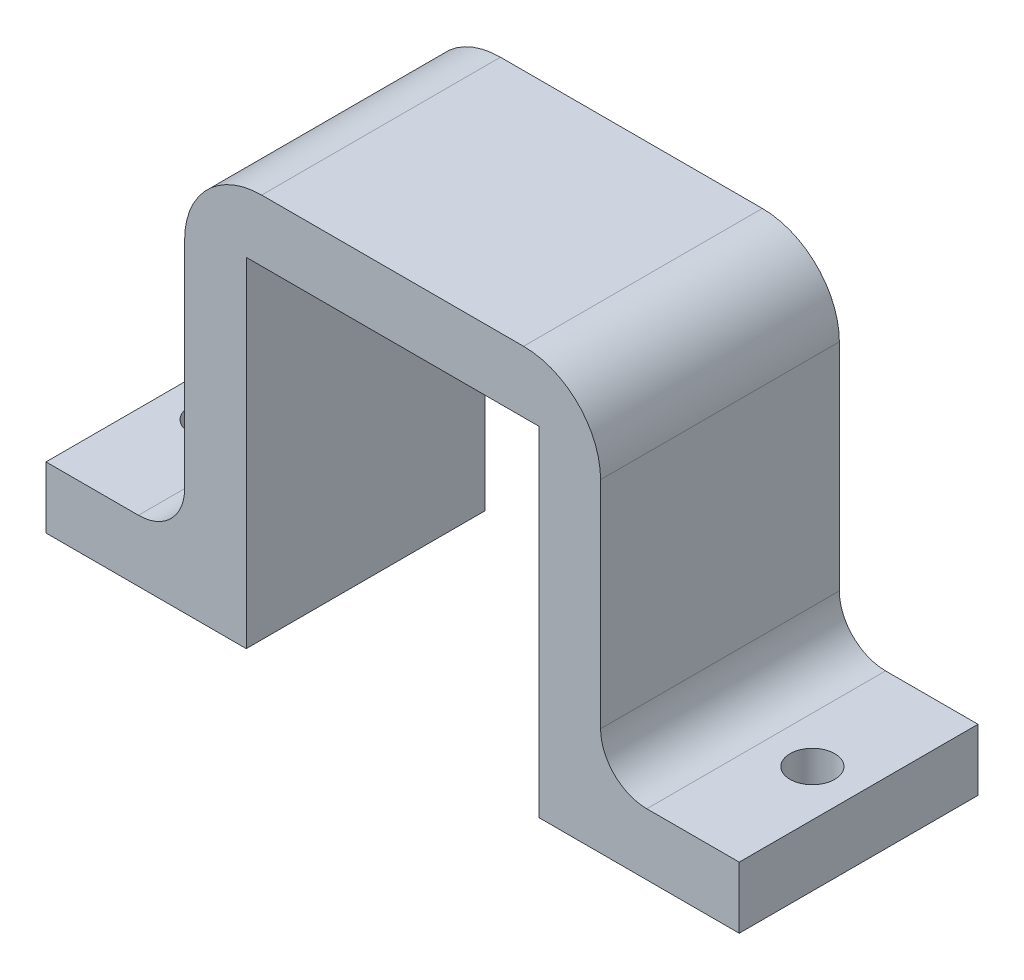
ISO-10303-21;
HEADER;
FILE_DESCRIPTION(('STEP AP214'),'2;1');
FILE_NAME('part.step','',(''),(''),'','','');
FILE_SCHEMA(('AUTOMOTIVE_DESIGN { 1 0 10303 214 1 1 1 1 }'));
ENDSEC;
DATA;
#1=APPLICATION_CONTEXT('core data for automotive mechanical design processes');
#2=APPLICATION_PROTOCOL_DEFINITION('international standard','automotive_design',2000,#1);
#3=PRODUCT_CONTEXT('',#1,'mechanical');
#4=PRODUCT('Part','Part','',(#3));
#5=PRODUCT_RELATED_PRODUCT_CATEGORY('part','',(#4));
#6=PRODUCT_DEFINITION_FORMATION('','',#4);
#7=PRODUCT_DEFINITION_CONTEXT('part definition',#1,'design');
#8=PRODUCT_DEFINITION('design','',#6,#7);
#9=PRODUCT_DEFINITION_SHAPE('','',#8);
#10=(LENGTH_UNIT() NAMED_UNIT(*) SI_UNIT(.MILLI.,.METRE.));
#11=(NAMED_UNIT(*) PLANE_ANGLE_UNIT() SI_UNIT($,.RADIAN.));
#12=(NAMED_UNIT(*) SI_UNIT($,.STERADIAN.) SOLID_ANGLE_UNIT());
#13=UNCERTAINTY_MEASURE_WITH_UNIT(LENGTH_MEASURE(1.E-05),#10,'distance_accuracy_value','');
#14=(GEOMETRIC_REPRESENTATION_CONTEXT(3) GLOBAL_UNCERTAINTY_ASSIGNED_CONTEXT((#13)) GLOBAL_UNIT_ASSIGNED_CONTEXT((#10,
#11,#12)) REPRESENTATION_CONTEXT('',''));
#15=CARTESIAN_POINT('',(0.,0.,0.));
#16=DIRECTION('',(0.,0.,1.));
#17=DIRECTION('',(1.,0.,0.));
#18=AXIS2_PLACEMENT_3D('',#15,#16,#17);
#19=CARTESIAN_POINT('',(0.,3.00000000000002,23.));
#20=DIRECTION('',(1.,0.,0.));
#21=DIRECTION('',(0.,0.,-1.));
#22=AXIS2_PLACEMENT_3D('',#19,#20,#21);
#23=PLANE('',#22);
#24=DIRECTION('',(0.,1.,0.));
#25=VECTOR('',#24,1.);
#26=CARTESIAN_POINT('',(0.,3.00000000000002,7.5));
#27=LINE('',#26,#25);
#28=CARTESIAN_POINT('',(0.,3.00000000000002,7.5));
#29=VERTEX_POINT('',#28);
#30=CARTESIAN_POINT('',(0.,17.,7.5));
#31=VERTEX_POINT('',#30);
#32=EDGE_CURVE('E301',#29,#31,#27,.T.);
#33=ORIENTED_EDGE('',*,*,#32,.F.);
#34=DIRECTION('',(0.,0.,-1.));
#35=VECTOR('',#34,1.);
#36=CARTESIAN_POINT('',(0.,3.00000000000002,23.));
#37=LINE('',#36,#35);
#38=CARTESIAN_POINT('',(0.,3.00000000000002,23.));
#39=VERTEX_POINT('',#38);
#40=EDGE_CURVE('E216',#39,#29,#37,.T.);
#41=ORIENTED_EDGE('',*,*,#40,.F.);
#42=DIRECTION('',(0.,-1.,0.));
#43=VECTOR('',#42,1.);
#44=CARTESIAN_POINT('',(0.,3.00000000000002,23.));
#45=LINE('',#44,#43);
#46=CARTESIAN_POINT('',(0.,17.,23.));
#47=VERTEX_POINT('',#46);
#48=EDGE_CURVE('E324',#47,#39,#45,.T.);
#49=ORIENTED_EDGE('',*,*,#48,.F.);
#50=DIRECTION('',(0.,0.,-1.));
#51=VECTOR('',#50,1.);
#52=CARTESIAN_POINT('',(0.,17.,23.));
#53=LINE('',#52,#51);
#54=EDGE_CURVE('E220',#47,#31,#53,.T.);
#55=ORIENTED_EDGE('',*,*,#54,.T.);
#56=EDGE_LOOP('',(#33,#41,#49,#55));
#57=FACE_BOUND('',#56,.T.);
#58=ADVANCED_FACE('F45',(#57),#23,.F.);
#59=CARTESIAN_POINT('',(-3.,3.,23.));
#60=DIRECTION('',(0.,0.,-1.));
#61=DIRECTION('',(-1.,0.,0.));
#62=AXIS2_PLACEMENT_3D('',#59,#60,#61);
#63=CYLINDRICAL_SURFACE('',#62,3.);
#64=CARTESIAN_POINT('',(-3.,3.,7.5));
#65=DIRECTION('',(0.,0.,-1.));
#66=DIRECTION('',(0.,1.,0.));
#67=AXIS2_PLACEMENT_3D('',#64,#65,#66);
#68=CIRCLE('',#67,3.);
#69=CARTESIAN_POINT('',(-3.00000000000002,0.,7.5));
#70=VERTEX_POINT('',#69);
#71=EDGE_CURVE('E298',#70,#29,#68,.F.);
#72=ORIENTED_EDGE('',*,*,#71,.F.);
#73=DIRECTION('',(0.,0.,-1.));
#74=VECTOR('',#73,1.);
#75=CARTESIAN_POINT('',(-3.00000000000002,0.,23.));
#76=LINE('',#75,#74);
#77=CARTESIAN_POINT('',(-3.00000000000002,0.,23.));
#78=VERTEX_POINT('',#77);
#79=EDGE_CURVE('E212',#78,#70,#76,.T.);
#80=ORIENTED_EDGE('',*,*,#79,.F.);
#81=CARTESIAN_POINT('',(-3.,3.,23.));
#82=DIRECTION('',(0.,0.,-1.));
#83=DIRECTION('',(-1.,0.,0.));
#84=AXIS2_PLACEMENT_3D('',#81,#82,#83);
#85=CIRCLE('',#84,3.);
#86=EDGE_CURVE('E327',#39,#78,#85,.T.);
#87=ORIENTED_EDGE('',*,*,#86,.F.);
#88=ORIENTED_EDGE('',*,*,#40,.T.);
#89=EDGE_LOOP('',(#72,#80,#87,#88));
#90=FACE_BOUND('',#89,.T.);
#91=ADVANCED_FACE('F375',(#90),#63,.F.);
#92=CARTESIAN_POINT('',(-9.,0.,23.));
#93=DIRECTION('',(0.,-1.,0.));
#94=DIRECTION('',(0.,0.,-1.));
#95=AXIS2_PLACEMENT_3D('',#92,#93,#94);
#96=PLANE('',#95);
#97=CARTESIAN_POINT('',(-6.00000000000001,0.,15.25));
#98=DIRECTION('',(0.,1.,0.));
#99=DIRECTION('',(0.,0.,1.));
#100=AXIS2_PLACEMENT_3D('',#97,#98,#99);
#101=CIRCLE('',#100,1.45);
#102=CARTESIAN_POINT('',(-6.00000000000001,0.,16.7));
#103=VERTEX_POINT('',#102);
#104=EDGE_CURVE('E248',#103,#103,#101,.T.);
#105=ORIENTED_EDGE('',*,*,#104,.F.);
#106=EDGE_LOOP('',(#105));
#107=FACE_BOUND('',#106,.T.);
#108=DIRECTION('',(1.,0.,0.));
#109=VECTOR('',#108,1.);
#110=CARTESIAN_POINT('',(-9.,0.,7.5));
#111=LINE('',#110,#109);
#112=CARTESIAN_POINT('',(-9.,0.,7.5));
#113=VERTEX_POINT('',#112);
#114=EDGE_CURVE('E295',#113,#70,#111,.T.);
#115=ORIENTED_EDGE('',*,*,#114,.F.);
#116=DIRECTION('',(0.,0.,-1.));
#117=VECTOR('',#116,1.);
#118=CARTESIAN_POINT('',(-9.,0.,23.));
#119=LINE('',#118,#117);
#120=CARTESIAN_POINT('',(-9.,0.,23.));
#121=VERTEX_POINT('',#120);
#122=EDGE_CURVE('E208',#121,#113,#119,.T.);
#123=ORIENTED_EDGE('',*,*,#122,.F.);
#124=DIRECTION('',(-1.,0.,0.));
#125=VECTOR('',#124,1.);
#126=CARTESIAN_POINT('',(-9.,0.,23.));
#127=LINE('',#126,#125);
#128=EDGE_CURVE('E330',#78,#121,#127,.T.);
#129=ORIENTED_EDGE('',*,*,#128,.F.);
#130=ORIENTED_EDGE('',*,*,#79,.T.);
#131=EDGE_LOOP('',(#115,#123,#129,#130));
#132=FACE_BOUND('',#131,.T.);
#133=ADVANCED_FACE('F370',(#107,#132),#96,.F.);
#134=CARTESIAN_POINT('',(-9.,-4.,23.));
#135=DIRECTION('',(1.,0.,0.));
#136=DIRECTION('',(0.,1.,0.));
#137=AXIS2_PLACEMENT_3D('',#134,#135,#136);
#138=PLANE('',#137);
#139=DIRECTION('',(0.,1.,0.));
#140=VECTOR('',#139,1.);
#141=CARTESIAN_POINT('',(-9.,-4.,7.5));
#142=LINE('',#141,#140);
#143=CARTESIAN_POINT('',(-9.,-4.,7.5));
#144=VERTEX_POINT('',#143);
#145=EDGE_CURVE('E292',#144,#113,#142,.T.);
#146=ORIENTED_EDGE('',*,*,#145,.F.);
#147=DIRECTION('',(0.,0.,-1.));
#148=VECTOR('',#147,1.);
#149=CARTESIAN_POINT('',(-9.,-4.,23.));
#150=LINE('',#149,#148);
#151=CARTESIAN_POINT('',(-9.,-4.,23.));
#152=VERTEX_POINT('',#151);
#153=EDGE_CURVE('E204',#152,#144,#150,.T.);
#154=ORIENTED_EDGE('',*,*,#153,.F.);
#155=DIRECTION('',(0.,-1.,0.));
#156=VECTOR('',#155,1.);
#157=CARTESIAN_POINT('',(-9.,-4.,23.));
#158=LINE('',#157,#156);
#159=EDGE_CURVE('E333',#121,#152,#158,.T.);
#160=ORIENTED_EDGE('',*,*,#159,.F.);
#161=ORIENTED_EDGE('',*,*,#122,.T.);
#162=EDGE_LOOP('',(#146,#154,#160,#161));
#163=FACE_BOUND('',#162,.T.);
#164=ADVANCED_FACE('F365',(#163),#138,.F.);
#165=CARTESIAN_POINT('',(4.,-4.,23.));
#166=DIRECTION('',(0.,1.,0.));
#167=DIRECTION('',(-1.,0.,0.));
#168=AXIS2_PLACEMENT_3D('',#165,#166,#167);
#169=PLANE('',#168);
#170=CARTESIAN_POINT('',(-6.00000000000001,-4.,15.25));
#171=DIRECTION('',(0.,1.,0.));
#172=DIRECTION('',(-1.,0.,0.));
#173=AXIS2_PLACEMENT_3D('',#170,#171,#172);
#174=CIRCLE('',#173,1.45);
#175=CARTESIAN_POINT('',(-7.45000000000001,-4.,15.25));
#176=VERTEX_POINT('',#175);
#177=EDGE_CURVE('E49',#176,#176,#174,.T.);
#178=ORIENTED_EDGE('',*,*,#177,.T.);
#179=EDGE_LOOP('',(#178));
#180=FACE_BOUND('',#179,.T.);
#181=DIRECTION('',(1.,0.,0.));
#182=VECTOR('',#181,1.);
#183=CARTESIAN_POINT('',(-23.,-4.,7.5));
#184=LINE('',#183,#182);
#185=CARTESIAN_POINT('',(4.,-4.,7.5));
#186=VERTEX_POINT('',#185);
#187=EDGE_CURVE('E288',#144,#186,#184,.T.);
#188=ORIENTED_EDGE('',*,*,#187,.T.);
#189=DIRECTION('',(0.,0.,-1.));
#190=VECTOR('',#189,1.);
#191=CARTESIAN_POINT('',(4.,-4.,23.));
#192=LINE('',#191,#190);
#193=CARTESIAN_POINT('',(4.,-4.,23.));
#194=VERTEX_POINT('',#193);
#195=EDGE_CURVE('E200',#194,#186,#192,.T.);
#196=ORIENTED_EDGE('',*,*,#195,.F.);
#197=DIRECTION('',(1.,0.,0.));
#198=VECTOR('',#197,1.);
#199=CARTESIAN_POINT('',(4.,-4.,23.));
#200=LINE('',#199,#198);
#201=EDGE_CURVE('E336',#152,#194,#200,.T.);
#202=ORIENTED_EDGE('',*,*,#201,.F.);
#203=ORIENTED_EDGE('',*,*,#153,.T.);
#204=EDGE_LOOP('',(#188,#196,#202,#203));
#205=FACE_BOUND('',#204,.T.);
#206=ADVANCED_FACE('F360',(#180,#205),#169,.F.);
#207=CARTESIAN_POINT('',(4.,18.,23.));
#208=DIRECTION('',(-1.,0.,0.));
#209=DIRECTION('',(0.,-1.,0.));
#210=AXIS2_PLACEMENT_3D('',#207,#208,#209);
#211=PLANE('',#210);
#212=DIRECTION('',(0.,-1.,0.));
#213=VECTOR('',#212,1.);
#214=CARTESIAN_POINT('',(4.,18.,7.5));
#215=LINE('',#214,#213);
#216=CARTESIAN_POINT('',(4.,18.,7.5));
#217=VERTEX_POINT('',#216);
#218=EDGE_CURVE('E11',#217,#186,#215,.T.);
#219=ORIENTED_EDGE('',*,*,#218,.F.);
#220=DIRECTION('',(0.,0.,-1.));
#221=VECTOR('',#220,1.);
#222=CARTESIAN_POINT('',(4.,18.,23.));
#223=LINE('',#222,#221);
#224=CARTESIAN_POINT('',(4.,18.,23.));
#225=VERTEX_POINT('',#224);
#226=EDGE_CURVE('E196',#225,#217,#223,.T.);
#227=ORIENTED_EDGE('',*,*,#226,.F.);
#228=DIRECTION('',(0.,1.,0.));
#229=VECTOR('',#228,1.);
#230=CARTESIAN_POINT('',(4.,18.,23.));
#231=LINE('',#230,#229);
#232=EDGE_CURVE('E339',#194,#225,#231,.T.);
#233=ORIENTED_EDGE('',*,*,#232,.F.);
#234=ORIENTED_EDGE('',*,*,#195,.T.);
#235=EDGE_LOOP('',(#219,#227,#233,#234));
#236=FACE_BOUND('',#235,.T.);
#237=ADVANCED_FACE('F356',(#236),#211,.F.);
#238=CARTESIAN_POINT('',(36.,0.,23.));
#239=DIRECTION('',(-1.,0.,0.));
#240=DIRECTION('',(0.,0.,1.));
#241=AXIS2_PLACEMENT_3D('',#238,#239,#240);
#242=PLANE('',#241);
#243=DIRECTION('',(0.,0.,-1.));
#244=VECTOR('',#243,1.);
#245=CARTESIAN_POINT('',(36.,-4.,23.));
#246=LINE('',#245,#244);
#247=CARTESIAN_POINT('',(36.,-4.,23.));
#248=VERTEX_POINT('',#247);
#249=CARTESIAN_POINT('',(36.,-4.00000000000001,7.5));
#250=VERTEX_POINT('',#249);
#251=EDGE_CURVE('E177',#248,#250,#246,.T.);
#252=ORIENTED_EDGE('',*,*,#251,.T.);
#253=DIRECTION('',(0.,1.,0.));
#254=VECTOR('',#253,1.);
#255=CARTESIAN_POINT('',(36.,-4.00000000000001,7.5));
#256=LINE('',#255,#254);
#257=CARTESIAN_POINT('',(36.,0.,7.5));
#258=VERTEX_POINT('',#257);
#259=EDGE_CURVE('E159',#250,#258,#256,.T.);
#260=ORIENTED_EDGE('',*,*,#259,.T.);
#261=DIRECTION('',(0.,0.,-1.));
#262=VECTOR('',#261,1.);
#263=CARTESIAN_POINT('',(36.,0.,23.));
#264=LINE('',#263,#262);
#265=CARTESIAN_POINT('',(36.,0.,23.));
#266=VERTEX_POINT('',#265);
#267=EDGE_CURVE('E55',#266,#258,#264,.T.);
#268=ORIENTED_EDGE('',*,*,#267,.F.);
#269=DIRECTION('',(0.,1.,0.));
#270=VECTOR('',#269,1.);
#271=CARTESIAN_POINT('',(36.,0.,23.));
#272=LINE('',#271,#270);
#273=EDGE_CURVE('E183',#248,#266,#272,.T.);
#274=ORIENTED_EDGE('',*,*,#273,.F.);
#275=EDGE_LOOP('',(#252,#260,#268,#274));
#276=FACE_BOUND('',#275,.T.);
#277=ADVANCED_FACE('F47',(#276),#242,.F.);
#278=CARTESIAN_POINT('',(30.,0.,23.));
#279=DIRECTION('',(0.,-1.,0.));
#280=DIRECTION('',(0.,0.,-1.));
#281=AXIS2_PLACEMENT_3D('',#278,#279,#280);
#282=PLANE('',#281);
#283=CARTESIAN_POINT('',(33.,0.,15.25));
#284=DIRECTION('',(0.,1.,0.));
#285=DIRECTION('',(0.,0.,-1.));
#286=AXIS2_PLACEMENT_3D('',#283,#284,#285);
#287=CIRCLE('',#286,1.45);
#288=CARTESIAN_POINT('',(33.,0.,13.8));
#289=VERTEX_POINT('',#288);
#290=EDGE_CURVE('E255',#289,#289,#287,.T.);
#291=ORIENTED_EDGE('',*,*,#290,.F.);
#292=EDGE_LOOP('',(#291));
#293=FACE_BOUND('',#292,.T.);
#294=ORIENTED_EDGE('',*,*,#267,.T.);
#295=DIRECTION('',(-1.,0.,0.));
#296=VECTOR('',#295,1.);
#297=CARTESIAN_POINT('',(30.,0.,7.5));
#298=LINE('',#297,#296);
#299=CARTESIAN_POINT('',(30.,0.,7.5));
#300=VERTEX_POINT('',#299);
#301=EDGE_CURVE('E166',#258,#300,#298,.T.);
#302=ORIENTED_EDGE('',*,*,#301,.T.);
#303=DIRECTION('',(0.,0.,-1.));
#304=VECTOR('',#303,1.);
#305=CARTESIAN_POINT('',(30.,0.,23.));
#306=LINE('',#305,#304);
#307=CARTESIAN_POINT('',(30.,0.,23.));
#308=VERTEX_POINT('',#307);
#309=EDGE_CURVE('E240',#308,#300,#306,.T.);
#310=ORIENTED_EDGE('',*,*,#309,.F.);
#311=DIRECTION('',(-1.,0.,0.));
#312=VECTOR('',#311,1.);
#313=CARTESIAN_POINT('',(30.,0.,23.));
#314=LINE('',#313,#312);
#315=EDGE_CURVE('E306',#266,#308,#314,.T.);
#316=ORIENTED_EDGE('',*,*,#315,.F.);
#317=EDGE_LOOP('',(#294,#302,#310,#316));
#318=FACE_BOUND('',#317,.T.);
#319=ADVANCED_FACE('F403',(#293,#318),#282,.F.);
#320=CARTESIAN_POINT('',(30.,3.,23.));
#321=DIRECTION('',(0.,0.,-1.));
#322=DIRECTION('',(-1.,0.,0.));
#323=AXIS2_PLACEMENT_3D('',#320,#321,#322);
#324=CYLINDRICAL_SURFACE('',#323,3.);
#325=ORIENTED_EDGE('',*,*,#309,.T.);
#326=CARTESIAN_POINT('',(30.,3.,7.5));
#327=DIRECTION('',(0.,0.,1.));
#328=DIRECTION('',(1.,0.,0.));
#329=AXIS2_PLACEMENT_3D('',#326,#327,#328);
#330=CIRCLE('',#329,3.);
#331=CARTESIAN_POINT('',(27.,3.,7.5));
#332=VERTEX_POINT('',#331);
#333=EDGE_CURVE('E282',#300,#332,#330,.F.);
#334=ORIENTED_EDGE('',*,*,#333,.T.);
#335=DIRECTION('',(0.,0.,-1.));
#336=VECTOR('',#335,1.);
#337=CARTESIAN_POINT('',(27.,3.,23.));
#338=LINE('',#337,#336);
#339=CARTESIAN_POINT('',(27.,3.,23.));
#340=VERTEX_POINT('',#339);
#341=EDGE_CURVE('E236',#340,#332,#338,.T.);
#342=ORIENTED_EDGE('',*,*,#341,.F.);
#343=CARTESIAN_POINT('',(30.,3.,23.));
#344=DIRECTION('',(0.,0.,-1.));
#345=DIRECTION('',(-1.,0.,0.));
#346=AXIS2_PLACEMENT_3D('',#343,#344,#345);
#347=CIRCLE('',#346,3.);
#348=EDGE_CURVE('E309',#308,#340,#347,.T.);
#349=ORIENTED_EDGE('',*,*,#348,.F.);
#350=EDGE_LOOP('',(#325,#334,#342,#349));
#351=FACE_BOUND('',#350,.T.);
#352=ADVANCED_FACE('F400',(#351),#324,.F.);
#353=CARTESIAN_POINT('',(27.,17.,23.));
#354=DIRECTION('',(-1.,0.,0.));
#355=DIRECTION('',(0.,-1.,0.));
#356=AXIS2_PLACEMENT_3D('',#353,#354,#355);
#357=PLANE('',#356);
#358=ORIENTED_EDGE('',*,*,#341,.T.);
#359=DIRECTION('',(0.,1.,0.));
#360=VECTOR('',#359,1.);
#361=CARTESIAN_POINT('',(27.,17.,7.5));
#362=LINE('',#361,#360);
#363=CARTESIAN_POINT('',(27.,17.,7.5));
#364=VERTEX_POINT('',#363);
#365=EDGE_CURVE('E278',#332,#364,#362,.T.);
#366=ORIENTED_EDGE('',*,*,#365,.T.);
#367=DIRECTION('',(0.,0.,-1.));
#368=VECTOR('',#367,1.);
#369=CARTESIAN_POINT('',(27.,17.,23.));
#370=LINE('',#369,#368);
#371=CARTESIAN_POINT('',(27.,17.,23.));
#372=VERTEX_POINT('',#371);
#373=EDGE_CURVE('E232',#372,#364,#370,.T.);
#374=ORIENTED_EDGE('',*,*,#373,.F.);
#375=DIRECTION('',(0.,1.,0.));
#376=VECTOR('',#375,1.);
#377=CARTESIAN_POINT('',(27.,17.,23.));
#378=LINE('',#377,#376);
#379=EDGE_CURVE('E312',#340,#372,#378,.T.);
#380=ORIENTED_EDGE('',*,*,#379,.F.);
#381=EDGE_LOOP('',(#358,#366,#374,#380));
#382=FACE_BOUND('',#381,.T.);
#383=ADVANCED_FACE('F396',(#382),#357,.F.);
#384=CARTESIAN_POINT('',(22.,17.,23.));
#385=DIRECTION('',(0.,0.,-1.));
#386=DIRECTION('',(-1.,0.,0.));
#387=AXIS2_PLACEMENT_3D('',#384,#385,#386);
#388=CYLINDRICAL_SURFACE('',#387,5.);
#389=ORIENTED_EDGE('',*,*,#373,.T.);
#390=CARTESIAN_POINT('',(22.,17.,7.5));
#391=DIRECTION('',(0.,0.,1.));
#392=DIRECTION('',(1.,0.,0.));
#393=AXIS2_PLACEMENT_3D('',#390,#391,#392);
#394=CIRCLE('',#393,5.);
#395=CARTESIAN_POINT('',(22.,22.,7.5));
#396=VERTEX_POINT('',#395);
#397=EDGE_CURVE('E274',#364,#396,#394,.T.);
#398=ORIENTED_EDGE('',*,*,#397,.T.);
#399=DIRECTION('',(0.,0.,-1.));
#400=VECTOR('',#399,1.);
#401=CARTESIAN_POINT('',(22.,22.,23.));
#402=LINE('',#401,#400);
#403=CARTESIAN_POINT('',(22.,22.,23.));
#404=VERTEX_POINT('',#403);
#405=EDGE_CURVE('E228',#404,#396,#402,.T.);
#406=ORIENTED_EDGE('',*,*,#405,.F.);
#407=CARTESIAN_POINT('',(22.,17.,23.));
#408=DIRECTION('',(0.,0.,1.));
#409=DIRECTION('',(-1.,0.,0.));
#410=AXIS2_PLACEMENT_3D('',#407,#408,#409);
#411=CIRCLE('',#410,5.);
#412=EDGE_CURVE('E315',#372,#404,#411,.T.);
#413=ORIENTED_EDGE('',*,*,#412,.F.);
#414=EDGE_LOOP('',(#389,#398,#406,#413));
#415=FACE_BOUND('',#414,.T.);
#416=ADVANCED_FACE('F394',(#415),#388,.T.);
#417=CARTESIAN_POINT('',(5.00000000000004,22.,23.));
#418=DIRECTION('',(0.,-1.,0.));
#419=DIRECTION('',(0.,0.,-1.));
#420=AXIS2_PLACEMENT_3D('',#417,#418,#419);
#421=PLANE('',#420);
#422=ORIENTED_EDGE('',*,*,#405,.T.);
#423=DIRECTION('',(1.,0.,0.));
#424=VECTOR('',#423,1.);
#425=CARTESIAN_POINT('',(-9.,22.,7.5));
#426=LINE('',#425,#424);
#427=CARTESIAN_POINT('',(5.,22.,7.5));
#428=VERTEX_POINT('',#427);
#429=EDGE_CURVE('E181',#428,#396,#426,.T.);
#430=ORIENTED_EDGE('',*,*,#429,.F.);
#431=DIRECTION('',(0.,0.,-1.));
#432=VECTOR('',#431,1.);
#433=CARTESIAN_POINT('',(5.00000000000004,22.,23.));
#434=LINE('',#433,#432);
#435=CARTESIAN_POINT('',(5.00000000000004,22.,23.));
#436=VERTEX_POINT('',#435);
#437=EDGE_CURVE('E224',#436,#428,#434,.T.);
#438=ORIENTED_EDGE('',*,*,#437,.F.);
#439=DIRECTION('',(-1.,0.,0.));
#440=VECTOR('',#439,1.);
#441=CARTESIAN_POINT('',(5.00000000000004,22.,23.));
#442=LINE('',#441,#440);
#443=EDGE_CURVE('E318',#404,#436,#442,.T.);
#444=ORIENTED_EDGE('',*,*,#443,.F.);
#445=EDGE_LOOP('',(#422,#430,#438,#444));
#446=FACE_BOUND('',#445,.T.);
#447=ADVANCED_FACE('F385',(#446),#421,.F.);
#448=CARTESIAN_POINT('',(5.,17.,23.));
#449=DIRECTION('',(0.,0.,-1.));
#450=DIRECTION('',(-1.,0.,0.));
#451=AXIS2_PLACEMENT_3D('',#448,#449,#450);
#452=CYLINDRICAL_SURFACE('',#451,5.);
#453=ORIENTED_EDGE('',*,*,#437,.T.);
#454=CARTESIAN_POINT('',(5.,17.,7.5));
#455=DIRECTION('',(0.,0.,1.));
#456=DIRECTION('',(1.,0.,0.));
#457=AXIS2_PLACEMENT_3D('',#454,#455,#456);
#458=CIRCLE('',#457,5.);
#459=EDGE_CURVE('E172',#428,#31,#458,.T.);
#460=ORIENTED_EDGE('',*,*,#459,.T.);
#461=ORIENTED_EDGE('',*,*,#54,.F.);
#462=CARTESIAN_POINT('',(5.,17.,23.));
#463=DIRECTION('',(0.,0.,1.));
#464=DIRECTION('',(1.,0.,0.));
#465=AXIS2_PLACEMENT_3D('',#462,#463,#464);
#466=CIRCLE('',#465,5.);
#467=EDGE_CURVE('E321',#436,#47,#466,.T.);
#468=ORIENTED_EDGE('',*,*,#467,.F.);
#469=EDGE_LOOP('',(#453,#460,#461,#468));
#470=FACE_BOUND('',#469,.T.);
#471=ADVANCED_FACE('F389',(#470),#452,.T.);
#472=CARTESIAN_POINT('',(23.,18.,23.));
#473=DIRECTION('',(0.,1.,0.));
#474=DIRECTION('',(-1.,0.,0.));
#475=AXIS2_PLACEMENT_3D('',#472,#473,#474);
#476=PLANE('',#475);
#477=ORIENTED_EDGE('',*,*,#226,.T.);
#478=DIRECTION('',(1.,0.,0.));
#479=VECTOR('',#478,1.);
#480=CARTESIAN_POINT('',(23.,18.,7.5));
#481=LINE('',#480,#479);
#482=CARTESIAN_POINT('',(23.,18.,7.5));
#483=VERTEX_POINT('',#482);
#484=EDGE_CURVE('E267',#217,#483,#481,.T.);
#485=ORIENTED_EDGE('',*,*,#484,.T.);
#486=DIRECTION('',(0.,0.,-1.));
#487=VECTOR('',#486,1.);
#488=CARTESIAN_POINT('',(23.,18.,23.));
#489=LINE('',#488,#487);
#490=CARTESIAN_POINT('',(23.,18.,23.));
#491=VERTEX_POINT('',#490);
#492=EDGE_CURVE('E188',#491,#483,#489,.T.);
#493=ORIENTED_EDGE('',*,*,#492,.F.);
#494=DIRECTION('',(1.,0.,0.));
#495=VECTOR('',#494,1.);
#496=CARTESIAN_POINT('',(23.,18.,23.));
#497=LINE('',#496,#495);
#498=EDGE_CURVE('E342',#225,#491,#497,.T.);
#499=ORIENTED_EDGE('',*,*,#498,.F.);
#500=EDGE_LOOP('',(#477,#485,#493,#499));
#501=FACE_BOUND('',#500,.T.);
#502=ADVANCED_FACE('F351',(#501),#476,.F.);
#503=CARTESIAN_POINT('',(23.,-4.,23.));
#504=DIRECTION('',(1.,0.,0.));
#505=DIRECTION('',(0.,0.,-1.));
#506=AXIS2_PLACEMENT_3D('',#503,#504,#505);
#507=PLANE('',#506);
#508=ORIENTED_EDGE('',*,*,#492,.T.);
#509=DIRECTION('',(0.,-1.,0.));
#510=VECTOR('',#509,1.);
#511=CARTESIAN_POINT('',(23.,-4.,7.5));
#512=LINE('',#511,#510);
#513=CARTESIAN_POINT('',(23.,-4.00000000000001,7.5));
#514=VERTEX_POINT('',#513);
#515=EDGE_CURVE('E271',#483,#514,#512,.T.);
#516=ORIENTED_EDGE('',*,*,#515,.T.);
#517=DIRECTION('',(0.,0.,-1.));
#518=VECTOR('',#517,1.);
#519=CARTESIAN_POINT('',(23.,-4.,23.));
#520=LINE('',#519,#518);
#521=CARTESIAN_POINT('',(23.,-4.,23.));
#522=VERTEX_POINT('',#521);
#523=EDGE_CURVE('E179',#522,#514,#520,.T.);
#524=ORIENTED_EDGE('',*,*,#523,.F.);
#525=DIRECTION('',(0.,-1.,0.));
#526=VECTOR('',#525,1.);
#527=CARTESIAN_POINT('',(23.,-4.,23.));
#528=LINE('',#527,#526);
#529=EDGE_CURVE('E68',#491,#522,#528,.T.);
#530=ORIENTED_EDGE('',*,*,#529,.F.);
#531=EDGE_LOOP('',(#508,#516,#524,#530));
#532=FACE_BOUND('',#531,.T.);
#533=ADVANCED_FACE('F354',(#532),#507,.F.);
#534=CARTESIAN_POINT('',(36.,-4.,23.));
#535=DIRECTION('',(0.,1.,0.));
#536=DIRECTION('',(-1.,0.,0.));
#537=AXIS2_PLACEMENT_3D('',#534,#535,#536);
#538=PLANE('',#537);
#539=CARTESIAN_POINT('',(33.,-4.,15.25));
#540=DIRECTION('',(0.,1.,0.));
#541=DIRECTION('',(-1.,0.,0.));
#542=AXIS2_PLACEMENT_3D('',#539,#540,#541);
#543=CIRCLE('',#542,1.45);
#544=CARTESIAN_POINT('',(31.55,-4.,15.25));
#545=VERTEX_POINT('',#544);
#546=EDGE_CURVE('E245',#545,#545,#543,.T.);
#547=ORIENTED_EDGE('',*,*,#546,.T.);
#548=EDGE_LOOP('',(#547));
#549=FACE_BOUND('',#548,.T.);
#550=ORIENTED_EDGE('',*,*,#523,.T.);
#551=DIRECTION('',(1.,0.,0.));
#552=VECTOR('',#551,1.);
#553=CARTESIAN_POINT('',(-9.,-4.00000000000001,7.5));
#554=LINE('',#553,#552);
#555=EDGE_CURVE('E163',#514,#250,#554,.T.);
#556=ORIENTED_EDGE('',*,*,#555,.T.);
#557=ORIENTED_EDGE('',*,*,#251,.F.);
#558=DIRECTION('',(1.,0.,0.));
#559=VECTOR('',#558,1.);
#560=CARTESIAN_POINT('',(36.,-4.,23.));
#561=LINE('',#560,#559);
#562=EDGE_CURVE('E63',#522,#248,#561,.T.);
#563=ORIENTED_EDGE('',*,*,#562,.F.);
#564=EDGE_LOOP('',(#550,#556,#557,#563));
#565=FACE_BOUND('',#564,.T.);
#566=ADVANCED_FACE('F176',(#549,#565),#538,.F.);
#567=CARTESIAN_POINT('',(-3.,3.,23.));
#568=DIRECTION('',(0.,0.,-1.));
#569=DIRECTION('',(-1.,0.,0.));
#570=AXIS2_PLACEMENT_3D('',#567,#568,#569);
#571=PLANE('',#570);
#572=ORIENTED_EDGE('',*,*,#273,.T.);
#573=ORIENTED_EDGE('',*,*,#315,.T.);
#574=ORIENTED_EDGE('',*,*,#348,.T.);
#575=ORIENTED_EDGE('',*,*,#379,.T.);
#576=ORIENTED_EDGE('',*,*,#412,.T.);
#577=ORIENTED_EDGE('',*,*,#443,.T.);
#578=ORIENTED_EDGE('',*,*,#467,.T.);
#579=ORIENTED_EDGE('',*,*,#48,.T.);
#580=ORIENTED_EDGE('',*,*,#86,.T.);
#581=ORIENTED_EDGE('',*,*,#128,.T.);
#582=ORIENTED_EDGE('',*,*,#159,.T.);
#583=ORIENTED_EDGE('',*,*,#201,.T.);
#584=ORIENTED_EDGE('',*,*,#232,.T.);
#585=ORIENTED_EDGE('',*,*,#498,.T.);
#586=ORIENTED_EDGE('',*,*,#529,.T.);
#587=ORIENTED_EDGE('',*,*,#562,.T.);
#588=EDGE_LOOP('',(#572,#573,#574,#575,#576,#577,#578,#579,#580,#581,#582,#583,#584,#585,#586,#587));
#589=FACE_BOUND('',#588,.T.);
#590=ADVANCED_FACE('F347',(#589),#571,.F.);
#591=CARTESIAN_POINT('',(-23.,17.,7.5));
#592=DIRECTION('',(0.,0.,-1.));
#593=DIRECTION('',(0.,1.,0.));
#594=AXIS2_PLACEMENT_3D('',#591,#592,#593);
#595=PLANE('',#594);
#596=ORIENTED_EDGE('',*,*,#32,.T.);
#597=ORIENTED_EDGE('',*,*,#459,.F.);
#598=ORIENTED_EDGE('',*,*,#429,.T.);
#599=ORIENTED_EDGE('',*,*,#397,.F.);
#600=ORIENTED_EDGE('',*,*,#365,.F.);
#601=ORIENTED_EDGE('',*,*,#333,.F.);
#602=ORIENTED_EDGE('',*,*,#301,.F.);
#603=ORIENTED_EDGE('',*,*,#259,.F.);
#604=ORIENTED_EDGE('',*,*,#555,.F.);
#605=ORIENTED_EDGE('',*,*,#515,.F.);
#606=ORIENTED_EDGE('',*,*,#484,.F.);
#607=ORIENTED_EDGE('',*,*,#218,.T.);
#608=ORIENTED_EDGE('',*,*,#187,.F.);
#609=ORIENTED_EDGE('',*,*,#145,.T.);
#610=ORIENTED_EDGE('',*,*,#114,.T.);
#611=ORIENTED_EDGE('',*,*,#71,.T.);
#612=EDGE_LOOP('',(#596,#597,#598,#599,#600,#601,#602,#603,#604,#605,#606,#607,#608,#609,#610,#611));
#613=FACE_BOUND('',#612,.T.);
#614=ADVANCED_FACE('F162',(#613),#595,.T.);
#615=CARTESIAN_POINT('',(33.,-26.,15.25));
#616=DIRECTION('',(0.,1.,0.));
#617=DIRECTION('',(0.,0.,1.));
#618=AXIS2_PLACEMENT_3D('',#615,#616,#617);
#619=CYLINDRICAL_SURFACE('',#618,1.45);
#620=ORIENTED_EDGE('',*,*,#290,.T.);
#621=EDGE_LOOP('',(#620));
#622=FACE_BOUND('',#621,.T.);
#623=ORIENTED_EDGE('',*,*,#546,.F.);
#624=EDGE_LOOP('',(#623));
#625=FACE_BOUND('',#624,.T.);
#626=ADVANCED_FACE('F472',(#622,#625),#619,.F.);
#627=CARTESIAN_POINT('',(-6.00000000000001,-26.,15.25));
#628=DIRECTION('',(0.,1.,0.));
#629=DIRECTION('',(0.,0.,1.));
#630=AXIS2_PLACEMENT_3D('',#627,#628,#629);
#631=CYLINDRICAL_SURFACE('',#630,1.45);
#632=ORIENTED_EDGE('',*,*,#104,.T.);
#633=EDGE_LOOP('',(#632));
#634=FACE_BOUND('',#633,.T.);
#635=ORIENTED_EDGE('',*,*,#177,.F.);
#636=EDGE_LOOP('',(#635));
#637=FACE_BOUND('',#636,.T.);
#638=ADVANCED_FACE('F524',(#634,#637),#631,.F.);
#639=CLOSED_SHELL('',(#58,#91,#133,#164,#206,#237,#277,#319,#352,#383,#416,#447,#471,#502,#533,
#566,#590,#614,#626,#638));
#640=MANIFOLD_SOLID_BREP('B2',#639);
#641=ADVANCED_BREP_SHAPE_REPRESENTATION('',(#18,#640),#14);
#642=SHAPE_DEFINITION_REPRESENTATION(#9,#641);
ENDSEC;
END-ISO-10303-21;
